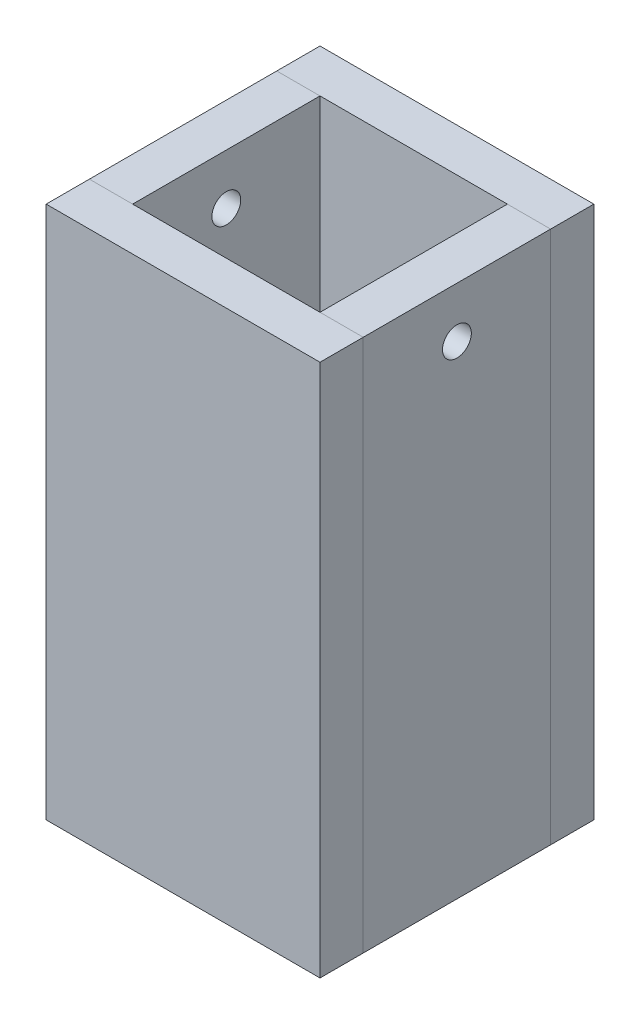
ISO-10303-21;
HEADER;
FILE_DESCRIPTION(('STEP AP214'),'2;1');
FILE_NAME('part.step','',(''),(''),'','','');
FILE_SCHEMA(('AUTOMOTIVE_DESIGN { 1 0 10303 214 1 1 1 1 }'));
ENDSEC;
DATA;
#1=APPLICATION_CONTEXT('core data for automotive mechanical design processes');
#2=APPLICATION_PROTOCOL_DEFINITION('international standard','automotive_design',2000,#1);
#3=PRODUCT_CONTEXT('',#1,'mechanical');
#4=PRODUCT('Part','Part','',(#3));
#5=PRODUCT_RELATED_PRODUCT_CATEGORY('part','',(#4));
#6=PRODUCT_DEFINITION_FORMATION('','',#4);
#7=PRODUCT_DEFINITION_CONTEXT('part definition',#1,'design');
#8=PRODUCT_DEFINITION('design','',#6,#7);
#9=PRODUCT_DEFINITION_SHAPE('','',#8);
#10=(LENGTH_UNIT() NAMED_UNIT(*) SI_UNIT(.MILLI.,.METRE.));
#11=(NAMED_UNIT(*) PLANE_ANGLE_UNIT() SI_UNIT($,.RADIAN.));
#12=(NAMED_UNIT(*) SI_UNIT($,.STERADIAN.) SOLID_ANGLE_UNIT());
#13=UNCERTAINTY_MEASURE_WITH_UNIT(LENGTH_MEASURE(1.E-05),#10,'distance_accuracy_value','');
#14=(GEOMETRIC_REPRESENTATION_CONTEXT(3) GLOBAL_UNCERTAINTY_ASSIGNED_CONTEXT((#13)) GLOBAL_UNIT_ASSIGNED_CONTEXT((#10,
#11,#12)) REPRESENTATION_CONTEXT('',''));
#15=CARTESIAN_POINT('',(0.,0.,0.));
#16=DIRECTION('',(0.,0.,1.));
#17=DIRECTION('',(1.,0.,0.));
#18=AXIS2_PLACEMENT_3D('',#15,#16,#17);
#19=CARTESIAN_POINT('',(-19.,74.,87.2428447730824));
#20=DIRECTION('',(1.,0.,0.));
#21=DIRECTION('',(0.,0.,-1.));
#22=AXIS2_PLACEMENT_3D('',#19,#20,#21);
#23=PLANE('',#22);
#24=CARTESIAN_POINT('',(-19.,67.,0.));
#25=DIRECTION('',(1.,0.,0.));
#26=DIRECTION('',(0.,0.,-1.));
#27=AXIS2_PLACEMENT_3D('',#24,#25,#26);
#28=CIRCLE('',#27,2.);
#29=CARTESIAN_POINT('',(-19.,67.,-2.));
#30=VERTEX_POINT('',#29);
#31=EDGE_CURVE('E119',#30,#30,#28,.F.);
#32=ORIENTED_EDGE('',*,*,#31,.F.);
#33=EDGE_LOOP('',(#32));
#34=FACE_BOUND('',#33,.T.);
#35=DIRECTION('',(0.,-1.,0.));
#36=VECTOR('',#35,1.);
#37=CARTESIAN_POINT('',(-19.,74.,13.));
#38=LINE('',#37,#36);
#39=CARTESIAN_POINT('',(-19.,74.,13.));
#40=VERTEX_POINT('',#39);
#41=CARTESIAN_POINT('',(-19.,0.,13.));
#42=VERTEX_POINT('',#41);
#43=EDGE_CURVE('E95',#40,#42,#38,.T.);
#44=ORIENTED_EDGE('',*,*,#43,.F.);
#45=DIRECTION('',(0.,0.,-1.));
#46=VECTOR('',#45,1.);
#47=CARTESIAN_POINT('',(-19.,74.,87.2428447730824));
#48=LINE('',#47,#46);
#49=CARTESIAN_POINT('',(-19.,74.,-13.));
#50=VERTEX_POINT('',#49);
#51=EDGE_CURVE('E61',#40,#50,#48,.T.);
#52=ORIENTED_EDGE('',*,*,#51,.T.);
#53=DIRECTION('',(0.,-1.,0.));
#54=VECTOR('',#53,1.);
#55=CARTESIAN_POINT('',(-19.,74.,-13.));
#56=LINE('',#55,#54);
#57=CARTESIAN_POINT('',(-19.,0.,-13.));
#58=VERTEX_POINT('',#57);
#59=EDGE_CURVE('E93',#50,#58,#56,.T.);
#60=ORIENTED_EDGE('',*,*,#59,.T.);
#61=DIRECTION('',(0.,0.,-1.));
#62=VECTOR('',#61,1.);
#63=CARTESIAN_POINT('',(-19.,0.,87.2428447730824));
#64=LINE('',#63,#62);
#65=EDGE_CURVE('E84',#42,#58,#64,.T.);
#66=ORIENTED_EDGE('',*,*,#65,.F.);
#67=EDGE_LOOP('',(#44,#52,#60,#66));
#68=FACE_BOUND('',#67,.T.);
#69=ADVANCED_FACE('F44',(#34,#68),#23,.F.);
#70=CARTESIAN_POINT('',(-19.,0.,87.2428447730824));
#71=DIRECTION('',(0.,1.,0.));
#72=DIRECTION('',(0.,0.,1.));
#73=AXIS2_PLACEMENT_3D('',#70,#71,#72);
#74=PLANE('',#73);
#75=DIRECTION('',(1.,0.,0.));
#76=VECTOR('',#75,1.);
#77=CARTESIAN_POINT('',(-19.,0.,13.));
#78=LINE('',#77,#76);
#79=CARTESIAN_POINT('',(-13.,0.,13.));
#80=VERTEX_POINT('',#79);
#81=EDGE_CURVE('E53',#42,#80,#78,.T.);
#82=ORIENTED_EDGE('',*,*,#81,.F.);
#83=ORIENTED_EDGE('',*,*,#65,.T.);
#84=DIRECTION('',(1.,0.,0.));
#85=VECTOR('',#84,1.);
#86=CARTESIAN_POINT('',(-19.,0.,-13.));
#87=LINE('',#86,#85);
#88=CARTESIAN_POINT('',(-13.,0.,-13.));
#89=VERTEX_POINT('',#88);
#90=EDGE_CURVE('E105',#58,#89,#87,.T.);
#91=ORIENTED_EDGE('',*,*,#90,.T.);
#92=DIRECTION('',(0.,0.,-1.));
#93=VECTOR('',#92,1.);
#94=CARTESIAN_POINT('',(-13.,0.,87.2428447730824));
#95=LINE('',#94,#93);
#96=EDGE_CURVE('E114',#80,#89,#95,.T.);
#97=ORIENTED_EDGE('',*,*,#96,.F.);
#98=EDGE_LOOP('',(#82,#83,#91,#97));
#99=FACE_BOUND('',#98,.T.);
#100=ADVANCED_FACE('F137',(#99),#74,.F.);
#101=CARTESIAN_POINT('',(-13.,0.,87.2428447730824));
#102=DIRECTION('',(-1.,0.,0.));
#103=DIRECTION('',(0.,0.,1.));
#104=AXIS2_PLACEMENT_3D('',#101,#102,#103);
#105=PLANE('',#104);
#106=CARTESIAN_POINT('',(-13.,67.,0.));
#107=DIRECTION('',(-1.,0.,0.));
#108=DIRECTION('',(0.,0.,1.));
#109=AXIS2_PLACEMENT_3D('',#106,#107,#108);
#110=CIRCLE('',#109,2.);
#111=CARTESIAN_POINT('',(-13.,67.,2.));
#112=VERTEX_POINT('',#111);
#113=EDGE_CURVE('E48',#112,#112,#110,.T.);
#114=ORIENTED_EDGE('',*,*,#113,.T.);
#115=EDGE_LOOP('',(#114));
#116=FACE_BOUND('',#115,.T.);
#117=DIRECTION('',(0.,1.,0.));
#118=VECTOR('',#117,1.);
#119=CARTESIAN_POINT('',(-13.,0.,13.));
#120=LINE('',#119,#118);
#121=CARTESIAN_POINT('',(-13.,74.,13.));
#122=VERTEX_POINT('',#121);
#123=EDGE_CURVE('E12',#80,#122,#120,.T.);
#124=ORIENTED_EDGE('',*,*,#123,.F.);
#125=ORIENTED_EDGE('',*,*,#96,.T.);
#126=DIRECTION('',(0.,1.,0.));
#127=VECTOR('',#126,1.);
#128=CARTESIAN_POINT('',(-13.,0.,-13.));
#129=LINE('',#128,#127);
#130=CARTESIAN_POINT('',(-13.,74.,-13.));
#131=VERTEX_POINT('',#130);
#132=EDGE_CURVE('E116',#89,#131,#129,.T.);
#133=ORIENTED_EDGE('',*,*,#132,.T.);
#134=DIRECTION('',(0.,0.,-1.));
#135=VECTOR('',#134,1.);
#136=CARTESIAN_POINT('',(-13.,74.,87.2428447730824));
#137=LINE('',#136,#135);
#138=EDGE_CURVE('E67',#122,#131,#137,.T.);
#139=ORIENTED_EDGE('',*,*,#138,.F.);
#140=EDGE_LOOP('',(#124,#125,#133,#139));
#141=FACE_BOUND('',#140,.T.);
#142=ADVANCED_FACE('F126',(#116,#141),#105,.F.);
#143=CARTESIAN_POINT('',(-13.,74.,87.2428447730824));
#144=DIRECTION('',(0.,-1.,0.));
#145=DIRECTION('',(0.,0.,-1.));
#146=AXIS2_PLACEMENT_3D('',#143,#144,#145);
#147=PLANE('',#146);
#148=DIRECTION('',(-1.,0.,0.));
#149=VECTOR('',#148,1.);
#150=CARTESIAN_POINT('',(-13.,74.,13.));
#151=LINE('',#150,#149);
#152=EDGE_CURVE('E102',#122,#40,#151,.T.);
#153=ORIENTED_EDGE('',*,*,#152,.F.);
#154=ORIENTED_EDGE('',*,*,#138,.T.);
#155=DIRECTION('',(-1.,0.,0.));
#156=VECTOR('',#155,1.);
#157=CARTESIAN_POINT('',(-13.,74.,-13.));
#158=LINE('',#157,#156);
#159=EDGE_CURVE('E98',#131,#50,#158,.T.);
#160=ORIENTED_EDGE('',*,*,#159,.T.);
#161=ORIENTED_EDGE('',*,*,#51,.F.);
#162=EDGE_LOOP('',(#153,#154,#160,#161));
#163=FACE_BOUND('',#162,.T.);
#164=ADVANCED_FACE('F99',(#163),#147,.F.);
#165=CARTESIAN_POINT('',(0.,0.,-13.));
#166=DIRECTION('',(0.,0.,1.));
#167=DIRECTION('',(1.,0.,0.));
#168=AXIS2_PLACEMENT_3D('',#165,#166,#167);
#169=PLANE('',#168);
#170=ORIENTED_EDGE('',*,*,#59,.F.);
#171=ORIENTED_EDGE('',*,*,#159,.F.);
#172=ORIENTED_EDGE('',*,*,#132,.F.);
#173=ORIENTED_EDGE('',*,*,#90,.F.);
#174=EDGE_LOOP('',(#170,#171,#172,#173));
#175=FACE_BOUND('',#174,.T.);
#176=ADVANCED_FACE('F104',(#175),#169,.F.);
#177=CARTESIAN_POINT('',(19.,74.,13.));
#178=DIRECTION('',(0.,0.,1.));
#179=DIRECTION('',(1.,0.,0.));
#180=AXIS2_PLACEMENT_3D('',#177,#178,#179);
#181=PLANE('',#180);
#182=ORIENTED_EDGE('',*,*,#152,.T.);
#183=ORIENTED_EDGE('',*,*,#43,.T.);
#184=ORIENTED_EDGE('',*,*,#81,.T.);
#185=ORIENTED_EDGE('',*,*,#123,.T.);
#186=EDGE_LOOP('',(#182,#183,#184,#185));
#187=FACE_BOUND('',#186,.T.);
#188=ADVANCED_FACE('F46',(#187),#181,.T.);
#189=CARTESIAN_POINT('',(-24.6568542494924,67.,0.));
#190=DIRECTION('',(1.,0.,0.));
#191=DIRECTION('',(0.,0.,-1.));
#192=AXIS2_PLACEMENT_3D('',#189,#190,#191);
#193=CYLINDRICAL_SURFACE('',#192,2.);
#194=ORIENTED_EDGE('',*,*,#31,.T.);
#195=EDGE_LOOP('',(#194));
#196=FACE_BOUND('',#195,.T.);
#197=ORIENTED_EDGE('',*,*,#113,.F.);
#198=EDGE_LOOP('',(#197));
#199=FACE_BOUND('',#198,.T.);
#200=ADVANCED_FACE('F128',(#196,#199),#193,.F.);
#201=CLOSED_SHELL('',(#69,#100,#142,#164,#176,#188,#200));
#202=MANIFOLD_SOLID_BREP('B2',#201);
#203=CARTESIAN_POINT('',(19.,0.,87.2428447730824));
#204=DIRECTION('',(-1.,0.,0.));
#205=DIRECTION('',(0.,0.,1.));
#206=AXIS2_PLACEMENT_3D('',#203,#204,#205);
#207=PLANE('',#206);
#208=CARTESIAN_POINT('',(19.,67.,0.));
#209=DIRECTION('',(1.,0.,0.));
#210=DIRECTION('',(0.,0.,-1.));
#211=AXIS2_PLACEMENT_3D('',#208,#209,#210);
#212=CIRCLE('',#211,2.);
#213=CARTESIAN_POINT('',(19.,67.,-2.));
#214=VERTEX_POINT('',#213);
#215=EDGE_CURVE('E274',#214,#214,#212,.T.);
#216=ORIENTED_EDGE('',*,*,#215,.F.);
#217=EDGE_LOOP('',(#216));
#218=FACE_BOUND('',#217,.T.);
#219=DIRECTION('',(0.,1.,0.));
#220=VECTOR('',#219,1.);
#221=CARTESIAN_POINT('',(19.,0.,13.));
#222=LINE('',#221,#220);
#223=CARTESIAN_POINT('',(19.,0.,13.));
#224=VERTEX_POINT('',#223);
#225=CARTESIAN_POINT('',(19.,74.,13.));
#226=VERTEX_POINT('',#225);
#227=EDGE_CURVE('E250',#224,#226,#222,.T.);
#228=ORIENTED_EDGE('',*,*,#227,.F.);
#229=DIRECTION('',(0.,0.,-1.));
#230=VECTOR('',#229,1.);
#231=CARTESIAN_POINT('',(19.,0.,87.2428447730824));
#232=LINE('',#231,#230);
#233=CARTESIAN_POINT('',(19.,0.,-13.));
#234=VERTEX_POINT('',#233);
#235=EDGE_CURVE('E216',#224,#234,#232,.T.);
#236=ORIENTED_EDGE('',*,*,#235,.T.);
#237=DIRECTION('',(0.,1.,0.));
#238=VECTOR('',#237,1.);
#239=CARTESIAN_POINT('',(19.,0.,-13.));
#240=LINE('',#239,#238);
#241=CARTESIAN_POINT('',(19.,74.,-13.));
#242=VERTEX_POINT('',#241);
#243=EDGE_CURVE('E248',#234,#242,#240,.T.);
#244=ORIENTED_EDGE('',*,*,#243,.T.);
#245=DIRECTION('',(0.,0.,-1.));
#246=VECTOR('',#245,1.);
#247=CARTESIAN_POINT('',(19.,74.,87.2428447730824));
#248=LINE('',#247,#246);
#249=EDGE_CURVE('E239',#226,#242,#248,.T.);
#250=ORIENTED_EDGE('',*,*,#249,.F.);
#251=EDGE_LOOP('',(#228,#236,#244,#250));
#252=FACE_BOUND('',#251,.T.);
#253=ADVANCED_FACE('F199',(#218,#252),#207,.F.);
#254=CARTESIAN_POINT('',(19.,74.,87.2428447730824));
#255=DIRECTION('',(0.,-1.,0.));
#256=DIRECTION('',(0.,0.,-1.));
#257=AXIS2_PLACEMENT_3D('',#254,#255,#256);
#258=PLANE('',#257);
#259=DIRECTION('',(-1.,0.,0.));
#260=VECTOR('',#259,1.);
#261=CARTESIAN_POINT('',(19.,74.,13.));
#262=LINE('',#261,#260);
#263=CARTESIAN_POINT('',(13.,74.,13.));
#264=VERTEX_POINT('',#263);
#265=EDGE_CURVE('E208',#226,#264,#262,.T.);
#266=ORIENTED_EDGE('',*,*,#265,.F.);
#267=ORIENTED_EDGE('',*,*,#249,.T.);
#268=DIRECTION('',(-1.,0.,0.));
#269=VECTOR('',#268,1.);
#270=CARTESIAN_POINT('',(19.,74.,-13.));
#271=LINE('',#270,#269);
#272=CARTESIAN_POINT('',(13.,74.,-13.));
#273=VERTEX_POINT('',#272);
#274=EDGE_CURVE('E260',#242,#273,#271,.T.);
#275=ORIENTED_EDGE('',*,*,#274,.T.);
#276=DIRECTION('',(0.,0.,-1.));
#277=VECTOR('',#276,1.);
#278=CARTESIAN_POINT('',(13.,74.,87.2428447730824));
#279=LINE('',#278,#277);
#280=EDGE_CURVE('E269',#264,#273,#279,.T.);
#281=ORIENTED_EDGE('',*,*,#280,.F.);
#282=EDGE_LOOP('',(#266,#267,#275,#281));
#283=FACE_BOUND('',#282,.T.);
#284=ADVANCED_FACE('F292',(#283),#258,.F.);
#285=CARTESIAN_POINT('',(13.,74.,87.2428447730824));
#286=DIRECTION('',(1.,0.,0.));
#287=DIRECTION('',(0.,1.,0.));
#288=AXIS2_PLACEMENT_3D('',#285,#286,#287);
#289=PLANE('',#288);
#290=CARTESIAN_POINT('',(13.,67.,0.));
#291=DIRECTION('',(1.,0.,0.));
#292=DIRECTION('',(0.,1.,0.));
#293=AXIS2_PLACEMENT_3D('',#290,#291,#292);
#294=CIRCLE('',#293,2.);
#295=CARTESIAN_POINT('',(13.,69.,0.));
#296=VERTEX_POINT('',#295);
#297=EDGE_CURVE('E203',#296,#296,#294,.T.);
#298=ORIENTED_EDGE('',*,*,#297,.T.);
#299=EDGE_LOOP('',(#298));
#300=FACE_BOUND('',#299,.T.);
#301=DIRECTION('',(0.,-1.,0.));
#302=VECTOR('',#301,1.);
#303=CARTESIAN_POINT('',(13.,74.,13.));
#304=LINE('',#303,#302);
#305=CARTESIAN_POINT('',(13.,0.,13.));
#306=VERTEX_POINT('',#305);
#307=EDGE_CURVE('E42',#264,#306,#304,.T.);
#308=ORIENTED_EDGE('',*,*,#307,.F.);
#309=ORIENTED_EDGE('',*,*,#280,.T.);
#310=DIRECTION('',(0.,-1.,0.));
#311=VECTOR('',#310,1.);
#312=CARTESIAN_POINT('',(13.,74.,-13.));
#313=LINE('',#312,#311);
#314=CARTESIAN_POINT('',(13.,0.,-13.));
#315=VERTEX_POINT('',#314);
#316=EDGE_CURVE('E271',#273,#315,#313,.T.);
#317=ORIENTED_EDGE('',*,*,#316,.T.);
#318=DIRECTION('',(0.,0.,-1.));
#319=VECTOR('',#318,1.);
#320=CARTESIAN_POINT('',(13.,0.,87.2428447730824));
#321=LINE('',#320,#319);
#322=EDGE_CURVE('E222',#306,#315,#321,.T.);
#323=ORIENTED_EDGE('',*,*,#322,.F.);
#324=EDGE_LOOP('',(#308,#309,#317,#323));
#325=FACE_BOUND('',#324,.T.);
#326=ADVANCED_FACE('F281',(#300,#325),#289,.F.);
#327=CARTESIAN_POINT('',(13.,0.,87.2428447730824));
#328=DIRECTION('',(0.,1.,0.));
#329=DIRECTION('',(0.,0.,1.));
#330=AXIS2_PLACEMENT_3D('',#327,#328,#329);
#331=PLANE('',#330);
#332=DIRECTION('',(1.,0.,0.));
#333=VECTOR('',#332,1.);
#334=CARTESIAN_POINT('',(13.,0.,13.));
#335=LINE('',#334,#333);
#336=EDGE_CURVE('E257',#306,#224,#335,.T.);
#337=ORIENTED_EDGE('',*,*,#336,.F.);
#338=ORIENTED_EDGE('',*,*,#322,.T.);
#339=DIRECTION('',(1.,0.,0.));
#340=VECTOR('',#339,1.);
#341=CARTESIAN_POINT('',(13.,0.,-13.));
#342=LINE('',#341,#340);
#343=EDGE_CURVE('E253',#315,#234,#342,.T.);
#344=ORIENTED_EDGE('',*,*,#343,.T.);
#345=ORIENTED_EDGE('',*,*,#235,.F.);
#346=EDGE_LOOP('',(#337,#338,#344,#345));
#347=FACE_BOUND('',#346,.T.);
#348=ADVANCED_FACE('F254',(#347),#331,.F.);
#349=CARTESIAN_POINT('',(0.,0.,-13.));
#350=DIRECTION('',(0.,0.,1.));
#351=DIRECTION('',(1.,0.,0.));
#352=AXIS2_PLACEMENT_3D('',#349,#350,#351);
#353=PLANE('',#352);
#354=ORIENTED_EDGE('',*,*,#243,.F.);
#355=ORIENTED_EDGE('',*,*,#343,.F.);
#356=ORIENTED_EDGE('',*,*,#316,.F.);
#357=ORIENTED_EDGE('',*,*,#274,.F.);
#358=EDGE_LOOP('',(#354,#355,#356,#357));
#359=FACE_BOUND('',#358,.T.);
#360=ADVANCED_FACE('F259',(#359),#353,.F.);
#361=CARTESIAN_POINT('',(19.,74.,13.));
#362=DIRECTION('',(0.,0.,1.));
#363=DIRECTION('',(1.,0.,0.));
#364=AXIS2_PLACEMENT_3D('',#361,#362,#363);
#365=PLANE('',#364);
#366=ORIENTED_EDGE('',*,*,#336,.T.);
#367=ORIENTED_EDGE('',*,*,#227,.T.);
#368=ORIENTED_EDGE('',*,*,#265,.T.);
#369=ORIENTED_EDGE('',*,*,#307,.T.);
#370=EDGE_LOOP('',(#366,#367,#368,#369));
#371=FACE_BOUND('',#370,.T.);
#372=ADVANCED_FACE('F201',(#371),#365,.T.);
#373=CARTESIAN_POINT('',(-24.6568542494924,67.,0.));
#374=DIRECTION('',(1.,0.,0.));
#375=DIRECTION('',(0.,0.,-1.));
#376=AXIS2_PLACEMENT_3D('',#373,#374,#375);
#377=CYLINDRICAL_SURFACE('',#376,2.);
#378=ORIENTED_EDGE('',*,*,#215,.T.);
#379=EDGE_LOOP('',(#378));
#380=FACE_BOUND('',#379,.T.);
#381=ORIENTED_EDGE('',*,*,#297,.F.);
#382=EDGE_LOOP('',(#381));
#383=FACE_BOUND('',#382,.T.);
#384=ADVANCED_FACE('F283',(#380,#383),#377,.F.);
#385=CLOSED_SHELL('',(#253,#284,#326,#348,#360,#372,#384));
#386=MANIFOLD_SOLID_BREP('B6',#385);
#387=CARTESIAN_POINT('',(19.,74.,13.));
#388=DIRECTION('',(0.,0.,1.));
#389=DIRECTION('',(1.,0.,0.));
#390=AXIS2_PLACEMENT_3D('',#387,#388,#389);
#391=PLANE('',#390);
#392=DIRECTION('',(-1.,0.,0.));
#393=VECTOR('',#392,1.);
#394=CARTESIAN_POINT('',(19.,0.,13.));
#395=LINE('',#394,#393);
#396=CARTESIAN_POINT('',(19.,0.,13.));
#397=VERTEX_POINT('',#396);
#398=CARTESIAN_POINT('',(-19.,0.,13.));
#399=VERTEX_POINT('',#398);
#400=EDGE_CURVE('E416',#397,#399,#395,.T.);
#401=ORIENTED_EDGE('',*,*,#400,.T.);
#402=DIRECTION('',(0.,-1.,0.));
#403=VECTOR('',#402,1.);
#404=CARTESIAN_POINT('',(-19.,74.,13.));
#405=LINE('',#404,#403);
#406=CARTESIAN_POINT('',(-19.,74.,13.));
#407=VERTEX_POINT('',#406);
#408=EDGE_CURVE('E197',#407,#399,#405,.T.);
#409=ORIENTED_EDGE('',*,*,#408,.F.);
#410=DIRECTION('',(-1.,0.,0.));
#411=VECTOR('',#410,1.);
#412=CARTESIAN_POINT('',(19.,74.,13.));
#413=LINE('',#412,#411);
#414=CARTESIAN_POINT('',(19.,74.,13.));
#415=VERTEX_POINT('',#414);
#416=EDGE_CURVE('E404',#415,#407,#413,.T.);
#417=ORIENTED_EDGE('',*,*,#416,.F.);
#418=DIRECTION('',(0.,-1.,0.));
#419=VECTOR('',#418,1.);
#420=CARTESIAN_POINT('',(19.,74.,13.));
#421=LINE('',#420,#419);
#422=EDGE_CURVE('E412',#415,#397,#421,.T.);
#423=ORIENTED_EDGE('',*,*,#422,.T.);
#424=EDGE_LOOP('',(#401,#409,#417,#423));
#425=FACE_BOUND('',#424,.T.);
#426=ADVANCED_FACE('F353',(#425),#391,.F.);
#427=CARTESIAN_POINT('',(-19.,74.,13.));
#428=DIRECTION('',(1.,0.,0.));
#429=DIRECTION('',(0.,0.,-1.));
#430=AXIS2_PLACEMENT_3D('',#427,#428,#429);
#431=PLANE('',#430);
#432=DIRECTION('',(0.,0.,1.));
#433=VECTOR('',#432,1.);
#434=CARTESIAN_POINT('',(-19.,0.,13.));
#435=LINE('',#434,#433);
#436=CARTESIAN_POINT('',(-19.,0.,19.));
#437=VERTEX_POINT('',#436);
#438=EDGE_CURVE('E408',#399,#437,#435,.T.);
#439=ORIENTED_EDGE('',*,*,#438,.T.);
#440=DIRECTION('',(0.,-1.,0.));
#441=VECTOR('',#440,1.);
#442=CARTESIAN_POINT('',(-19.,74.,19.));
#443=LINE('',#442,#441);
#444=CARTESIAN_POINT('',(-19.,74.,19.));
#445=VERTEX_POINT('',#444);
#446=EDGE_CURVE('E361',#445,#437,#443,.T.);
#447=ORIENTED_EDGE('',*,*,#446,.F.);
#448=DIRECTION('',(0.,0.,1.));
#449=VECTOR('',#448,1.);
#450=CARTESIAN_POINT('',(-19.,74.,13.));
#451=LINE('',#450,#449);
#452=EDGE_CURVE('E399',#407,#445,#451,.T.);
#453=ORIENTED_EDGE('',*,*,#452,.F.);
#454=ORIENTED_EDGE('',*,*,#408,.T.);
#455=EDGE_LOOP('',(#439,#447,#453,#454));
#456=FACE_BOUND('',#455,.T.);
#457=ADVANCED_FACE('F407',(#456),#431,.F.);
#458=CARTESIAN_POINT('',(19.,74.,19.));
#459=DIRECTION('',(0.,0.,-1.));
#460=DIRECTION('',(-1.,0.,0.));
#461=AXIS2_PLACEMENT_3D('',#458,#459,#460);
#462=PLANE('',#461);
#463=DIRECTION('',(1.,0.,0.));
#464=VECTOR('',#463,1.);
#465=CARTESIAN_POINT('',(19.,0.,19.));
#466=LINE('',#465,#464);
#467=CARTESIAN_POINT('',(19.,0.,19.));
#468=VERTEX_POINT('',#467);
#469=EDGE_CURVE('E386',#437,#468,#466,.T.);
#470=ORIENTED_EDGE('',*,*,#469,.T.);
#471=DIRECTION('',(0.,-1.,0.));
#472=VECTOR('',#471,1.);
#473=CARTESIAN_POINT('',(19.,74.,19.));
#474=LINE('',#473,#472);
#475=CARTESIAN_POINT('',(19.,74.,19.));
#476=VERTEX_POINT('',#475);
#477=EDGE_CURVE('E409',#476,#468,#474,.T.);
#478=ORIENTED_EDGE('',*,*,#477,.F.);
#479=DIRECTION('',(1.,0.,0.));
#480=VECTOR('',#479,1.);
#481=CARTESIAN_POINT('',(19.,74.,19.));
#482=LINE('',#481,#480);
#483=EDGE_CURVE('E402',#445,#476,#482,.T.);
#484=ORIENTED_EDGE('',*,*,#483,.F.);
#485=ORIENTED_EDGE('',*,*,#446,.T.);
#486=EDGE_LOOP('',(#470,#478,#484,#485));
#487=FACE_BOUND('',#486,.T.);
#488=ADVANCED_FACE('F410',(#487),#462,.F.);
#489=CARTESIAN_POINT('',(19.,74.,19.));
#490=DIRECTION('',(-1.,0.,0.));
#491=DIRECTION('',(0.,0.,1.));
#492=AXIS2_PLACEMENT_3D('',#489,#490,#491);
#493=PLANE('',#492);
#494=DIRECTION('',(0.,0.,-1.));
#495=VECTOR('',#494,1.);
#496=CARTESIAN_POINT('',(19.,0.,19.));
#497=LINE('',#496,#495);
#498=EDGE_CURVE('E392',#468,#397,#497,.T.);
#499=ORIENTED_EDGE('',*,*,#498,.T.);
#500=ORIENTED_EDGE('',*,*,#422,.F.);
#501=DIRECTION('',(0.,0.,-1.));
#502=VECTOR('',#501,1.);
#503=CARTESIAN_POINT('',(19.,74.,19.));
#504=LINE('',#503,#502);
#505=EDGE_CURVE('E369',#476,#415,#504,.T.);
#506=ORIENTED_EDGE('',*,*,#505,.F.);
#507=ORIENTED_EDGE('',*,*,#477,.T.);
#508=EDGE_LOOP('',(#499,#500,#506,#507));
#509=FACE_BOUND('',#508,.T.);
#510=ADVANCED_FACE('F423',(#509),#493,.F.);
#511=CARTESIAN_POINT('',(0.,74.,0.));
#512=DIRECTION('',(0.,1.,0.));
#513=DIRECTION('',(0.,0.,1.));
#514=AXIS2_PLACEMENT_3D('',#511,#512,#513);
#515=PLANE('',#514);
#516=ORIENTED_EDGE('',*,*,#416,.T.);
#517=ORIENTED_EDGE('',*,*,#452,.T.);
#518=ORIENTED_EDGE('',*,*,#483,.T.);
#519=ORIENTED_EDGE('',*,*,#505,.T.);
#520=EDGE_LOOP('',(#516,#517,#518,#519));
#521=FACE_BOUND('',#520,.T.);
#522=ADVANCED_FACE('F400',(#521),#515,.T.);
#523=CARTESIAN_POINT('',(0.,0.,0.));
#524=DIRECTION('',(0.,1.,0.));
#525=DIRECTION('',(0.,0.,1.));
#526=AXIS2_PLACEMENT_3D('',#523,#524,#525);
#527=PLANE('',#526);
#528=ORIENTED_EDGE('',*,*,#400,.F.);
#529=ORIENTED_EDGE('',*,*,#498,.F.);
#530=ORIENTED_EDGE('',*,*,#469,.F.);
#531=ORIENTED_EDGE('',*,*,#438,.F.);
#532=EDGE_LOOP('',(#528,#529,#530,#531));
#533=FACE_BOUND('',#532,.T.);
#534=ADVANCED_FACE('F426',(#533),#527,.F.);
#535=CLOSED_SHELL('',(#426,#457,#488,#510,#522,#534));
#536=MANIFOLD_SOLID_BREP('B36',#535);
#537=CARTESIAN_POINT('',(19.,74.,-13.));
#538=DIRECTION('',(-1.,0.,0.));
#539=DIRECTION('',(0.,0.,1.));
#540=AXIS2_PLACEMENT_3D('',#537,#538,#539);
#541=PLANE('',#540);
#542=DIRECTION('',(0.,0.,-1.));
#543=VECTOR('',#542,1.);
#544=CARTESIAN_POINT('',(19.,0.,-13.));
#545=LINE('',#544,#543);
#546=CARTESIAN_POINT('',(19.,0.,-13.));
#547=VERTEX_POINT('',#546);
#548=CARTESIAN_POINT('',(19.,0.,-19.));
#549=VERTEX_POINT('',#548);
#550=EDGE_CURVE('E540',#547,#549,#545,.T.);
#551=ORIENTED_EDGE('',*,*,#550,.T.);
#552=DIRECTION('',(0.,-1.,0.));
#553=VECTOR('',#552,1.);
#554=CARTESIAN_POINT('',(19.,74.,-19.));
#555=LINE('',#554,#553);
#556=CARTESIAN_POINT('',(19.,74.,-19.));
#557=VERTEX_POINT('',#556);
#558=EDGE_CURVE('E351',#557,#549,#555,.T.);
#559=ORIENTED_EDGE('',*,*,#558,.F.);
#560=DIRECTION('',(0.,0.,-1.));
#561=VECTOR('',#560,1.);
#562=CARTESIAN_POINT('',(19.,74.,-13.));
#563=LINE('',#562,#561);
#564=CARTESIAN_POINT('',(19.,74.,-13.));
#565=VERTEX_POINT('',#564);
#566=EDGE_CURVE('E528',#565,#557,#563,.T.);
#567=ORIENTED_EDGE('',*,*,#566,.F.);
#568=DIRECTION('',(0.,-1.,0.));
#569=VECTOR('',#568,1.);
#570=CARTESIAN_POINT('',(19.,74.,-13.));
#571=LINE('',#570,#569);
#572=EDGE_CURVE('E536',#565,#547,#571,.T.);
#573=ORIENTED_EDGE('',*,*,#572,.T.);
#574=EDGE_LOOP('',(#551,#559,#567,#573));
#575=FACE_BOUND('',#574,.T.);
#576=ADVANCED_FACE('F477',(#575),#541,.F.);
#577=CARTESIAN_POINT('',(19.,74.,-19.));
#578=DIRECTION('',(0.,0.,1.));
#579=DIRECTION('',(1.,0.,0.));
#580=AXIS2_PLACEMENT_3D('',#577,#578,#579);
#581=PLANE('',#580);
#582=DIRECTION('',(-1.,0.,0.));
#583=VECTOR('',#582,1.);
#584=CARTESIAN_POINT('',(19.,0.,-19.));
#585=LINE('',#584,#583);
#586=CARTESIAN_POINT('',(-19.,0.,-19.));
#587=VERTEX_POINT('',#586);
#588=EDGE_CURVE('E532',#549,#587,#585,.T.);
#589=ORIENTED_EDGE('',*,*,#588,.T.);
#590=DIRECTION('',(0.,-1.,0.));
#591=VECTOR('',#590,1.);
#592=CARTESIAN_POINT('',(-19.,74.,-19.));
#593=LINE('',#592,#591);
#594=CARTESIAN_POINT('',(-19.,74.,-19.));
#595=VERTEX_POINT('',#594);
#596=EDGE_CURVE('E485',#595,#587,#593,.T.);
#597=ORIENTED_EDGE('',*,*,#596,.F.);
#598=DIRECTION('',(-1.,0.,0.));
#599=VECTOR('',#598,1.);
#600=CARTESIAN_POINT('',(19.,74.,-19.));
#601=LINE('',#600,#599);
#602=EDGE_CURVE('E523',#557,#595,#601,.T.);
#603=ORIENTED_EDGE('',*,*,#602,.F.);
#604=ORIENTED_EDGE('',*,*,#558,.T.);
#605=EDGE_LOOP('',(#589,#597,#603,#604));
#606=FACE_BOUND('',#605,.T.);
#607=ADVANCED_FACE('F531',(#606),#581,.F.);
#608=CARTESIAN_POINT('',(-19.,74.,-19.));
#609=DIRECTION('',(1.,0.,0.));
#610=DIRECTION('',(0.,0.,-1.));
#611=AXIS2_PLACEMENT_3D('',#608,#609,#610);
#612=PLANE('',#611);
#613=DIRECTION('',(0.,0.,1.));
#614=VECTOR('',#613,1.);
#615=CARTESIAN_POINT('',(-19.,0.,-19.));
#616=LINE('',#615,#614);
#617=CARTESIAN_POINT('',(-19.,0.,-13.));
#618=VERTEX_POINT('',#617);
#619=EDGE_CURVE('E510',#587,#618,#616,.T.);
#620=ORIENTED_EDGE('',*,*,#619,.T.);
#621=DIRECTION('',(0.,-1.,0.));
#622=VECTOR('',#621,1.);
#623=CARTESIAN_POINT('',(-19.,74.,-13.));
#624=LINE('',#623,#622);
#625=CARTESIAN_POINT('',(-19.,74.,-13.));
#626=VERTEX_POINT('',#625);
#627=EDGE_CURVE('E533',#626,#618,#624,.T.);
#628=ORIENTED_EDGE('',*,*,#627,.F.);
#629=DIRECTION('',(0.,0.,1.));
#630=VECTOR('',#629,1.);
#631=CARTESIAN_POINT('',(-19.,74.,-19.));
#632=LINE('',#631,#630);
#633=EDGE_CURVE('E526',#595,#626,#632,.T.);
#634=ORIENTED_EDGE('',*,*,#633,.F.);
#635=ORIENTED_EDGE('',*,*,#596,.T.);
#636=EDGE_LOOP('',(#620,#628,#634,#635));
#637=FACE_BOUND('',#636,.T.);
#638=ADVANCED_FACE('F534',(#637),#612,.F.);
#639=CARTESIAN_POINT('',(-19.,74.,-13.));
#640=DIRECTION('',(0.,0.,-1.));
#641=DIRECTION('',(-1.,0.,0.));
#642=AXIS2_PLACEMENT_3D('',#639,#640,#641);
#643=PLANE('',#642);
#644=DIRECTION('',(1.,0.,0.));
#645=VECTOR('',#644,1.);
#646=CARTESIAN_POINT('',(-19.,0.,-13.));
#647=LINE('',#646,#645);
#648=EDGE_CURVE('E516',#618,#547,#647,.T.);
#649=ORIENTED_EDGE('',*,*,#648,.T.);
#650=ORIENTED_EDGE('',*,*,#572,.F.);
#651=DIRECTION('',(1.,0.,0.));
#652=VECTOR('',#651,1.);
#653=CARTESIAN_POINT('',(-19.,74.,-13.));
#654=LINE('',#653,#652);
#655=EDGE_CURVE('E493',#626,#565,#654,.T.);
#656=ORIENTED_EDGE('',*,*,#655,.F.);
#657=ORIENTED_EDGE('',*,*,#627,.T.);
#658=EDGE_LOOP('',(#649,#650,#656,#657));
#659=FACE_BOUND('',#658,.T.);
#660=ADVANCED_FACE('F547',(#659),#643,.F.);
#661=CARTESIAN_POINT('',(0.,74.,0.));
#662=DIRECTION('',(0.,1.,0.));
#663=DIRECTION('',(0.,0.,1.));
#664=AXIS2_PLACEMENT_3D('',#661,#662,#663);
#665=PLANE('',#664);
#666=ORIENTED_EDGE('',*,*,#566,.T.);
#667=ORIENTED_EDGE('',*,*,#602,.T.);
#668=ORIENTED_EDGE('',*,*,#633,.T.);
#669=ORIENTED_EDGE('',*,*,#655,.T.);
#670=EDGE_LOOP('',(#666,#667,#668,#669));
#671=FACE_BOUND('',#670,.T.);
#672=ADVANCED_FACE('F524',(#671),#665,.T.);
#673=CARTESIAN_POINT('',(0.,0.,0.));
#674=DIRECTION('',(0.,1.,0.));
#675=DIRECTION('',(0.,0.,1.));
#676=AXIS2_PLACEMENT_3D('',#673,#674,#675);
#677=PLANE('',#676);
#678=ORIENTED_EDGE('',*,*,#550,.F.);
#679=ORIENTED_EDGE('',*,*,#648,.F.);
#680=ORIENTED_EDGE('',*,*,#619,.F.);
#681=ORIENTED_EDGE('',*,*,#588,.F.);
#682=EDGE_LOOP('',(#678,#679,#680,#681));
#683=FACE_BOUND('',#682,.T.);
#684=ADVANCED_FACE('F550',(#683),#677,.F.);
#685=CLOSED_SHELL('',(#576,#607,#638,#660,#672,#684));
#686=MANIFOLD_SOLID_BREP('B191',#685);
#687=ADVANCED_BREP_SHAPE_REPRESENTATION('',(#18,#202,#386,#536,#686),#14);
#688=SHAPE_DEFINITION_REPRESENTATION(#9,#687);
ENDSEC;
END-ISO-10303-21;
